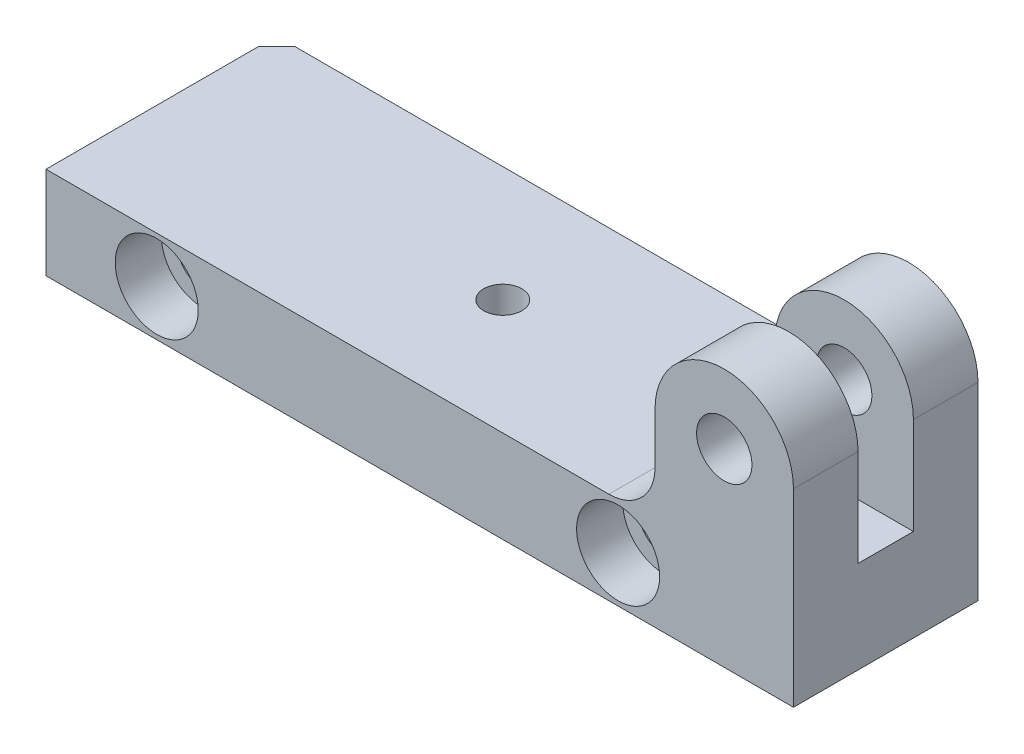
ISO-10303-21;
HEADER;
FILE_DESCRIPTION(('STEP AP214'),'2;1');
FILE_NAME('part.step','',(''),(''),'','','');
FILE_SCHEMA(('AUTOMOTIVE_DESIGN { 1 0 10303 214 1 1 1 1 }'));
ENDSEC;
DATA;
#1=APPLICATION_CONTEXT('core data for automotive mechanical design processes');
#2=APPLICATION_PROTOCOL_DEFINITION('international standard','automotive_design',2000,#1);
#3=PRODUCT_CONTEXT('',#1,'mechanical');
#4=PRODUCT('Part','Part','',(#3));
#5=PRODUCT_RELATED_PRODUCT_CATEGORY('part','',(#4));
#6=PRODUCT_DEFINITION_FORMATION('','',#4);
#7=PRODUCT_DEFINITION_CONTEXT('part definition',#1,'design');
#8=PRODUCT_DEFINITION('design','',#6,#7);
#9=PRODUCT_DEFINITION_SHAPE('','',#8);
#10=(LENGTH_UNIT() NAMED_UNIT(*) SI_UNIT(.MILLI.,.METRE.));
#11=(NAMED_UNIT(*) PLANE_ANGLE_UNIT() SI_UNIT($,.RADIAN.));
#12=(NAMED_UNIT(*) SI_UNIT($,.STERADIAN.) SOLID_ANGLE_UNIT());
#13=UNCERTAINTY_MEASURE_WITH_UNIT(LENGTH_MEASURE(1.E-05),#10,'distance_accuracy_value','');
#14=(GEOMETRIC_REPRESENTATION_CONTEXT(3) GLOBAL_UNCERTAINTY_ASSIGNED_CONTEXT((#13)) GLOBAL_UNIT_ASSIGNED_CONTEXT((#10,
#11,#12)) REPRESENTATION_CONTEXT('',''));
#15=CARTESIAN_POINT('',(0.,0.,0.));
#16=DIRECTION('',(0.,0.,1.));
#17=DIRECTION('',(1.,0.,0.));
#18=AXIS2_PLACEMENT_3D('',#15,#16,#17);
#19=CARTESIAN_POINT('',(-15.,15.,0.));
#20=DIRECTION('',(-1.,0.,0.));
#21=DIRECTION('',(0.,0.,1.));
#22=AXIS2_PLACEMENT_3D('',#19,#20,#21);
#23=PLANE('',#22);
#24=DIRECTION('',(0.,1.,0.));
#25=VECTOR('',#24,1.);
#26=CARTESIAN_POINT('',(-15.,10.,12.));
#27=LINE('',#26,#25);
#28=CARTESIAN_POINT('',(-15.,15.,12.));
#29=VERTEX_POINT('',#28);
#30=CARTESIAN_POINT('',(-15.,20.5,12.));
#31=VERTEX_POINT('',#30);
#32=EDGE_CURVE('E148',#29,#31,#27,.T.);
#33=ORIENTED_EDGE('',*,*,#32,.T.);
#34=DIRECTION('',(0.,0.,1.));
#35=VECTOR('',#34,1.);
#36=CARTESIAN_POINT('',(-15.,20.5,0.));
#37=LINE('',#36,#35);
#38=CARTESIAN_POINT('',(-15.,20.5,4.99999999999998));
#39=VERTEX_POINT('',#38);
#40=EDGE_CURVE('E123',#39,#31,#37,.T.);
#41=ORIENTED_EDGE('',*,*,#40,.F.);
#42=DIRECTION('',(0.,1.,0.));
#43=VECTOR('',#42,1.);
#44=CARTESIAN_POINT('',(-15.,10.,4.99999999999998));
#45=LINE('',#44,#43);
#46=CARTESIAN_POINT('',(-15.,15.,4.99999999999998));
#47=VERTEX_POINT('',#46);
#48=EDGE_CURVE('E118',#39,#47,#45,.F.);
#49=ORIENTED_EDGE('',*,*,#48,.T.);
#50=DIRECTION('',(0.,0.,1.));
#51=VECTOR('',#50,1.);
#52=CARTESIAN_POINT('',(-15.,15.,0.));
#53=LINE('',#52,#51);
#54=EDGE_CURVE('E120',#47,#29,#53,.T.);
#55=ORIENTED_EDGE('',*,*,#54,.T.);
#56=EDGE_LOOP('',(#33,#41,#49,#55));
#57=FACE_BOUND('',#56,.T.);
#58=ADVANCED_FACE('F17',(#57),#23,.T.);
#59=CARTESIAN_POINT('',(-7.5,20.5,0.));
#60=DIRECTION('',(0.,0.,1.));
#61=DIRECTION('',(1.,0.,0.));
#62=AXIS2_PLACEMENT_3D('',#59,#60,#61);
#63=CYLINDRICAL_SURFACE('',#62,3.);
#64=CARTESIAN_POINT('',(-7.5,20.5,12.));
#65=DIRECTION('',(0.,0.,1.));
#66=DIRECTION('',(1.,0.,0.));
#67=AXIS2_PLACEMENT_3D('',#64,#65,#66);
#68=CIRCLE('',#67,3.);
#69=CARTESIAN_POINT('',(-4.5,20.5,12.));
#70=VERTEX_POINT('',#69);
#71=EDGE_CURVE('E151',#70,#70,#68,.T.);
#72=ORIENTED_EDGE('',*,*,#71,.T.);
#73=EDGE_LOOP('',(#72));
#74=FACE_BOUND('',#73,.T.);
#75=CARTESIAN_POINT('',(-7.5,20.5,4.99999999999998));
#76=DIRECTION('',(0.,0.,1.));
#77=DIRECTION('',(1.,0.,0.));
#78=AXIS2_PLACEMENT_3D('',#75,#76,#77);
#79=CIRCLE('',#78,3.);
#80=CARTESIAN_POINT('',(-4.5,20.5,4.99999999999998));
#81=VERTEX_POINT('',#80);
#82=EDGE_CURVE('E140',#81,#81,#79,.F.);
#83=ORIENTED_EDGE('',*,*,#82,.T.);
#84=EDGE_LOOP('',(#83));
#85=FACE_BOUND('',#84,.T.);
#86=ADVANCED_FACE('F424',(#74,#85),#63,.F.);
#87=CARTESIAN_POINT('',(-69.,5.,20.));
#88=DIRECTION('',(0.,0.,1.));
#89=DIRECTION('',(1.,0.,0.));
#90=AXIS2_PLACEMENT_3D('',#87,#88,#89);
#91=PLANE('',#90);
#92=CARTESIAN_POINT('',(-69.,5.,20.));
#93=DIRECTION('',(0.,0.,1.));
#94=DIRECTION('',(1.,0.,0.));
#95=AXIS2_PLACEMENT_3D('',#92,#93,#94);
#96=CIRCLE('',#95,2.75);
#97=CARTESIAN_POINT('',(-66.25,5.,20.));
#98=VERTEX_POINT('',#97);
#99=EDGE_CURVE('E171',#98,#98,#96,.F.);
#100=ORIENTED_EDGE('',*,*,#99,.T.);
#101=EDGE_LOOP('',(#100));
#102=FACE_BOUND('',#101,.T.);
#103=CARTESIAN_POINT('',(-69.,5.,20.));
#104=DIRECTION('',(0.,0.,1.));
#105=DIRECTION('',(1.,0.,0.));
#106=AXIS2_PLACEMENT_3D('',#103,#104,#105);
#107=CIRCLE('',#106,4.5);
#108=CARTESIAN_POINT('',(-64.5,5.,20.));
#109=VERTEX_POINT('',#108);
#110=EDGE_CURVE('E161',#109,#109,#107,.T.);
#111=ORIENTED_EDGE('',*,*,#110,.T.);
#112=EDGE_LOOP('',(#111));
#113=FACE_BOUND('',#112,.T.);
#114=ADVANCED_FACE('F421',(#102,#113),#91,.T.);
#115=CARTESIAN_POINT('',(-19.,5.,20.));
#116=DIRECTION('',(0.,0.,1.));
#117=DIRECTION('',(1.,0.,0.));
#118=AXIS2_PLACEMENT_3D('',#115,#116,#117);
#119=PLANE('',#118);
#120=CARTESIAN_POINT('',(-19.,5.,20.));
#121=DIRECTION('',(0.,0.,1.));
#122=DIRECTION('',(1.,0.,0.));
#123=AXIS2_PLACEMENT_3D('',#120,#121,#122);
#124=CIRCLE('',#123,2.75);
#125=CARTESIAN_POINT('',(-16.25,5.,20.));
#126=VERTEX_POINT('',#125);
#127=EDGE_CURVE('E174',#126,#126,#124,.F.);
#128=ORIENTED_EDGE('',*,*,#127,.T.);
#129=EDGE_LOOP('',(#128));
#130=FACE_BOUND('',#129,.T.);
#131=CARTESIAN_POINT('',(-19.,5.,20.));
#132=DIRECTION('',(0.,0.,1.));
#133=DIRECTION('',(1.,0.,0.));
#134=AXIS2_PLACEMENT_3D('',#131,#132,#133);
#135=CIRCLE('',#134,4.5);
#136=CARTESIAN_POINT('',(-14.5,5.,20.));
#137=VERTEX_POINT('',#136);
#138=EDGE_CURVE('E165',#137,#137,#135,.T.);
#139=ORIENTED_EDGE('',*,*,#138,.T.);
#140=EDGE_LOOP('',(#139));
#141=FACE_BOUND('',#140,.T.);
#142=ADVANCED_FACE('F418',(#130,#141),#119,.T.);
#143=CARTESIAN_POINT('',(-20.,15.,0.));
#144=DIRECTION('',(0.,0.,1.));
#145=DIRECTION('',(1.,0.,0.));
#146=AXIS2_PLACEMENT_3D('',#143,#144,#145);
#147=CYLINDRICAL_SURFACE('',#146,5.);
#148=DIRECTION('',(0.,0.,1.));
#149=VECTOR('',#148,1.);
#150=CARTESIAN_POINT('',(-20.,10.,0.));
#151=LINE('',#150,#149);
#152=CARTESIAN_POINT('',(-20.,10.,12.));
#153=VERTEX_POINT('',#152);
#154=CARTESIAN_POINT('',(-20.,10.,4.99999999999999));
#155=VERTEX_POINT('',#154);
#156=EDGE_CURVE('E211',#153,#155,#151,.F.);
#157=ORIENTED_EDGE('',*,*,#156,.F.);
#158=CARTESIAN_POINT('',(-20.,15.,12.));
#159=DIRECTION('',(0.,0.,1.));
#160=DIRECTION('',(1.,0.,0.));
#161=AXIS2_PLACEMENT_3D('',#158,#159,#160);
#162=CIRCLE('',#161,5.);
#163=EDGE_CURVE('E133',#153,#29,#162,.T.);
#164=ORIENTED_EDGE('',*,*,#163,.T.);
#165=ORIENTED_EDGE('',*,*,#54,.F.);
#166=CARTESIAN_POINT('',(-20.,15.,4.99999999999999));
#167=DIRECTION('',(0.,0.,1.));
#168=DIRECTION('',(1.,0.,0.));
#169=AXIS2_PLACEMENT_3D('',#166,#167,#168);
#170=CIRCLE('',#169,5.);
#171=EDGE_CURVE('E20',#47,#155,#170,.F.);
#172=ORIENTED_EDGE('',*,*,#171,.T.);
#173=EDGE_LOOP('',(#157,#164,#165,#172));
#174=FACE_BOUND('',#173,.T.);
#175=ADVANCED_FACE('F131',(#174),#147,.F.);
#176=CARTESIAN_POINT('',(6.07456205532587,10.,4.99999999999998));
#177=DIRECTION('',(0.,0.,1.));
#178=DIRECTION('',(1.,0.,0.));
#179=AXIS2_PLACEMENT_3D('',#176,#177,#178);
#180=PLANE('',#179);
#181=ORIENTED_EDGE('',*,*,#82,.F.);
#182=EDGE_LOOP('',(#181));
#183=FACE_BOUND('',#182,.T.);
#184=DIRECTION('',(1.,0.,0.));
#185=VECTOR('',#184,1.);
#186=CARTESIAN_POINT('',(-81.,10.,4.99999999999999));
#187=LINE('',#186,#185);
#188=CARTESIAN_POINT('',(0.,10.,4.99999999999999));
#189=VERTEX_POINT('',#188);
#190=EDGE_CURVE('E138',#155,#189,#187,.T.);
#191=ORIENTED_EDGE('',*,*,#190,.F.);
#192=ORIENTED_EDGE('',*,*,#171,.F.);
#193=ORIENTED_EDGE('',*,*,#48,.F.);
#194=CARTESIAN_POINT('',(-7.5,20.5,4.99999999999998));
#195=DIRECTION('',(0.,0.,1.));
#196=DIRECTION('',(1.,0.,0.));
#197=AXIS2_PLACEMENT_3D('',#194,#195,#196);
#198=CIRCLE('',#197,7.5);
#199=CARTESIAN_POINT('',(0.,20.5,4.99999999999998));
#200=VERTEX_POINT('',#199);
#201=EDGE_CURVE('E142',#200,#39,#198,.T.);
#202=ORIENTED_EDGE('',*,*,#201,.F.);
#203=DIRECTION('',(0.,1.,0.));
#204=VECTOR('',#203,1.);
#205=CARTESIAN_POINT('',(0.,20.5,4.99999999999998));
#206=LINE('',#205,#204);
#207=EDGE_CURVE('E240',#189,#200,#206,.T.);
#208=ORIENTED_EDGE('',*,*,#207,.F.);
#209=EDGE_LOOP('',(#191,#192,#193,#202,#208));
#210=FACE_BOUND('',#209,.T.);
#211=ADVANCED_FACE('F136',(#183,#210),#180,.F.);
#212=CARTESIAN_POINT('',(-7.5,20.5,0.));
#213=DIRECTION('',(0.,0.,1.));
#214=DIRECTION('',(1.,0.,0.));
#215=AXIS2_PLACEMENT_3D('',#212,#213,#214);
#216=CYLINDRICAL_SURFACE('',#215,7.5);
#217=CARTESIAN_POINT('',(-7.5,20.5,12.));
#218=DIRECTION('',(0.,0.,1.));
#219=DIRECTION('',(1.,0.,0.));
#220=AXIS2_PLACEMENT_3D('',#217,#218,#219);
#221=CIRCLE('',#220,7.5);
#222=CARTESIAN_POINT('',(0.,20.5,12.));
#223=VERTEX_POINT('',#222);
#224=EDGE_CURVE('E149',#31,#223,#221,.F.);
#225=ORIENTED_EDGE('',*,*,#224,.T.);
#226=DIRECTION('',(0.,0.,-1.));
#227=VECTOR('',#226,1.);
#228=CARTESIAN_POINT('',(0.,20.5,0.));
#229=LINE('',#228,#227);
#230=EDGE_CURVE('E246',#200,#223,#229,.F.);
#231=ORIENTED_EDGE('',*,*,#230,.F.);
#232=ORIENTED_EDGE('',*,*,#201,.T.);
#233=ORIENTED_EDGE('',*,*,#40,.T.);
#234=EDGE_LOOP('',(#225,#231,#232,#233));
#235=FACE_BOUND('',#234,.T.);
#236=ADVANCED_FACE('F373',(#235),#216,.T.);
#237=CARTESIAN_POINT('',(-52.9946393017664,10.,12.));
#238=DIRECTION('',(0.,0.,-1.));
#239=DIRECTION('',(-1.,0.,0.));
#240=AXIS2_PLACEMENT_3D('',#237,#238,#239);
#241=PLANE('',#240);
#242=ORIENTED_EDGE('',*,*,#71,.F.);
#243=EDGE_LOOP('',(#242));
#244=FACE_BOUND('',#243,.T.);
#245=ORIENTED_EDGE('',*,*,#224,.F.);
#246=ORIENTED_EDGE('',*,*,#32,.F.);
#247=ORIENTED_EDGE('',*,*,#163,.F.);
#248=DIRECTION('',(1.,0.,0.));
#249=VECTOR('',#248,1.);
#250=CARTESIAN_POINT('',(-81.,10.,12.));
#251=LINE('',#250,#249);
#252=CARTESIAN_POINT('',(0.,10.,12.));
#253=VERTEX_POINT('',#252);
#254=EDGE_CURVE('E213',#253,#153,#251,.F.);
#255=ORIENTED_EDGE('',*,*,#254,.F.);
#256=DIRECTION('',(0.,1.,0.));
#257=VECTOR('',#256,1.);
#258=CARTESIAN_POINT('',(0.,20.5,12.));
#259=LINE('',#258,#257);
#260=EDGE_CURVE('E249',#223,#253,#259,.F.);
#261=ORIENTED_EDGE('',*,*,#260,.F.);
#262=EDGE_LOOP('',(#245,#246,#247,#255,#261));
#263=FACE_BOUND('',#262,.T.);
#264=ADVANCED_FACE('F371',(#244,#263),#241,.F.);
#265=CARTESIAN_POINT('',(5.02476111880649,10.,18.));
#266=DIRECTION('',(0.,0.,1.));
#267=DIRECTION('',(1.,0.,0.));
#268=AXIS2_PLACEMENT_3D('',#265,#266,#267);
#269=PLANE('',#268);
#270=CARTESIAN_POINT('',(-7.5,20.5,18.));
#271=DIRECTION('',(0.,0.,1.));
#272=DIRECTION('',(1.,0.,0.));
#273=AXIS2_PLACEMENT_3D('',#270,#271,#272);
#274=CIRCLE('',#273,3.);
#275=CARTESIAN_POINT('',(-4.5,20.5,18.));
#276=VERTEX_POINT('',#275);
#277=EDGE_CURVE('E168',#276,#276,#274,.T.);
#278=ORIENTED_EDGE('',*,*,#277,.T.);
#279=EDGE_LOOP('',(#278));
#280=FACE_BOUND('',#279,.T.);
#281=DIRECTION('',(1.,0.,0.));
#282=VECTOR('',#281,1.);
#283=CARTESIAN_POINT('',(-81.,10.,18.));
#284=LINE('',#283,#282);
#285=CARTESIAN_POINT('',(-20.,10.,18.));
#286=VERTEX_POINT('',#285);
#287=CARTESIAN_POINT('',(0.,10.,18.));
#288=VERTEX_POINT('',#287);
#289=EDGE_CURVE('E260',#286,#288,#284,.T.);
#290=ORIENTED_EDGE('',*,*,#289,.F.);
#291=CARTESIAN_POINT('',(-20.,15.,18.));
#292=DIRECTION('',(0.,0.,1.));
#293=DIRECTION('',(1.,0.,0.));
#294=AXIS2_PLACEMENT_3D('',#291,#292,#293);
#295=CIRCLE('',#294,5.);
#296=CARTESIAN_POINT('',(-15.,15.,18.));
#297=VERTEX_POINT('',#296);
#298=EDGE_CURVE('E158',#286,#297,#295,.T.);
#299=ORIENTED_EDGE('',*,*,#298,.T.);
#300=DIRECTION('',(0.,1.,0.));
#301=VECTOR('',#300,1.);
#302=CARTESIAN_POINT('',(-15.,15.,18.));
#303=LINE('',#302,#301);
#304=CARTESIAN_POINT('',(-15.,20.5,18.));
#305=VERTEX_POINT('',#304);
#306=EDGE_CURVE('E157',#305,#297,#303,.F.);
#307=ORIENTED_EDGE('',*,*,#306,.F.);
#308=CARTESIAN_POINT('',(-7.5,20.5,18.));
#309=DIRECTION('',(0.,0.,1.));
#310=DIRECTION('',(1.,0.,0.));
#311=AXIS2_PLACEMENT_3D('',#308,#309,#310);
#312=CIRCLE('',#311,7.5);
#313=CARTESIAN_POINT('',(0.,20.5,18.));
#314=VERTEX_POINT('',#313);
#315=EDGE_CURVE('E154',#314,#305,#312,.T.);
#316=ORIENTED_EDGE('',*,*,#315,.F.);
#317=DIRECTION('',(0.,1.,0.));
#318=VECTOR('',#317,1.);
#319=CARTESIAN_POINT('',(0.,20.5,18.));
#320=LINE('',#319,#318);
#321=EDGE_CURVE('E268',#288,#314,#320,.T.);
#322=ORIENTED_EDGE('',*,*,#321,.F.);
#323=EDGE_LOOP('',(#290,#299,#307,#316,#322));
#324=FACE_BOUND('',#323,.T.);
#325=ADVANCED_FACE('F380',(#280,#324),#269,.F.);
#326=CARTESIAN_POINT('',(-7.5,20.5,0.));
#327=DIRECTION('',(0.,0.,1.));
#328=DIRECTION('',(1.,0.,0.));
#329=AXIS2_PLACEMENT_3D('',#326,#327,#328);
#330=CYLINDRICAL_SURFACE('',#329,7.5);
#331=CARTESIAN_POINT('',(-7.5,20.5,25.));
#332=DIRECTION('',(0.,0.,1.));
#333=DIRECTION('',(1.,0.,0.));
#334=AXIS2_PLACEMENT_3D('',#331,#332,#333);
#335=CIRCLE('',#334,7.5);
#336=CARTESIAN_POINT('',(0.,20.5,25.));
#337=VERTEX_POINT('',#336);
#338=CARTESIAN_POINT('',(-15.,20.5,25.));
#339=VERTEX_POINT('',#338);
#340=EDGE_CURVE('E178',#337,#339,#335,.T.);
#341=ORIENTED_EDGE('',*,*,#340,.F.);
#342=DIRECTION('',(0.,0.,-1.));
#343=VECTOR('',#342,1.);
#344=CARTESIAN_POINT('',(0.,20.5,0.));
#345=LINE('',#344,#343);
#346=EDGE_CURVE('E273',#314,#337,#345,.F.);
#347=ORIENTED_EDGE('',*,*,#346,.F.);
#348=ORIENTED_EDGE('',*,*,#315,.T.);
#349=DIRECTION('',(0.,0.,1.));
#350=VECTOR('',#349,1.);
#351=CARTESIAN_POINT('',(-15.,20.5,0.));
#352=LINE('',#351,#350);
#353=EDGE_CURVE('E210',#339,#305,#352,.F.);
#354=ORIENTED_EDGE('',*,*,#353,.F.);
#355=EDGE_LOOP('',(#341,#347,#348,#354));
#356=FACE_BOUND('',#355,.T.);
#357=ADVANCED_FACE('F382',(#356),#330,.T.);
#358=CARTESIAN_POINT('',(-15.,15.,0.));
#359=DIRECTION('',(-1.,0.,0.));
#360=DIRECTION('',(0.,0.,1.));
#361=AXIS2_PLACEMENT_3D('',#358,#359,#360);
#362=PLANE('',#361);
#363=DIRECTION('',(0.,1.,0.));
#364=VECTOR('',#363,1.);
#365=CARTESIAN_POINT('',(-15.,7.89915521810206,25.));
#366=LINE('',#365,#364);
#367=CARTESIAN_POINT('',(-15.,15.,25.));
#368=VERTEX_POINT('',#367);
#369=EDGE_CURVE('E181',#339,#368,#366,.F.);
#370=ORIENTED_EDGE('',*,*,#369,.F.);
#371=ORIENTED_EDGE('',*,*,#353,.T.);
#372=ORIENTED_EDGE('',*,*,#306,.T.);
#373=DIRECTION('',(0.,0.,1.));
#374=VECTOR('',#373,1.);
#375=CARTESIAN_POINT('',(-15.,15.,0.));
#376=LINE('',#375,#374);
#377=EDGE_CURVE('E162',#297,#368,#376,.T.);
#378=ORIENTED_EDGE('',*,*,#377,.T.);
#379=EDGE_LOOP('',(#370,#371,#372,#378));
#380=FACE_BOUND('',#379,.T.);
#381=ADVANCED_FACE('F386',(#380),#362,.T.);
#382=CARTESIAN_POINT('',(-20.,15.,0.));
#383=DIRECTION('',(0.,0.,1.));
#384=DIRECTION('',(1.,0.,0.));
#385=AXIS2_PLACEMENT_3D('',#382,#383,#384);
#386=CYLINDRICAL_SURFACE('',#385,5.);
#387=DIRECTION('',(0.,0.,1.));
#388=VECTOR('',#387,1.);
#389=CARTESIAN_POINT('',(-20.,10.,0.));
#390=LINE('',#389,#388);
#391=CARTESIAN_POINT('',(-20.,10.,25.));
#392=VERTEX_POINT('',#391);
#393=EDGE_CURVE('E177',#392,#286,#390,.F.);
#394=ORIENTED_EDGE('',*,*,#393,.F.);
#395=CARTESIAN_POINT('',(-20.,15.,25.));
#396=DIRECTION('',(0.,0.,1.));
#397=DIRECTION('',(1.,0.,0.));
#398=AXIS2_PLACEMENT_3D('',#395,#396,#397);
#399=CIRCLE('',#398,5.);
#400=EDGE_CURVE('E183',#368,#392,#399,.F.);
#401=ORIENTED_EDGE('',*,*,#400,.F.);
#402=ORIENTED_EDGE('',*,*,#377,.F.);
#403=ORIENTED_EDGE('',*,*,#298,.F.);
#404=EDGE_LOOP('',(#394,#401,#402,#403));
#405=FACE_BOUND('',#404,.T.);
#406=ADVANCED_FACE('F389',(#405),#386,.F.);
#407=CARTESIAN_POINT('',(-69.,5.,22.5));
#408=DIRECTION('',(0.,0.,1.));
#409=DIRECTION('',(1.,0.,0.));
#410=AXIS2_PLACEMENT_3D('',#407,#408,#409);
#411=CYLINDRICAL_SURFACE('',#410,4.5);
#412=ORIENTED_EDGE('',*,*,#110,.F.);
#413=EDGE_LOOP('',(#412));
#414=FACE_BOUND('',#413,.T.);
#415=CARTESIAN_POINT('',(-69.,5.,25.));
#416=DIRECTION('',(0.,0.,1.));
#417=DIRECTION('',(1.,0.,0.));
#418=AXIS2_PLACEMENT_3D('',#415,#416,#417);
#419=CIRCLE('',#418,4.5);
#420=CARTESIAN_POINT('',(-64.5,5.,25.));
#421=VERTEX_POINT('',#420);
#422=EDGE_CURVE('E187',#421,#421,#419,.F.);
#423=ORIENTED_EDGE('',*,*,#422,.F.);
#424=EDGE_LOOP('',(#423));
#425=FACE_BOUND('',#424,.T.);
#426=ADVANCED_FACE('F391',(#414,#425),#411,.F.);
#427=CARTESIAN_POINT('',(-19.,5.,22.5));
#428=DIRECTION('',(0.,0.,1.));
#429=DIRECTION('',(1.,0.,0.));
#430=AXIS2_PLACEMENT_3D('',#427,#428,#429);
#431=CYLINDRICAL_SURFACE('',#430,4.5);
#432=ORIENTED_EDGE('',*,*,#138,.F.);
#433=EDGE_LOOP('',(#432));
#434=FACE_BOUND('',#433,.T.);
#435=CARTESIAN_POINT('',(-19.,5.,25.));
#436=DIRECTION('',(0.,0.,1.));
#437=DIRECTION('',(1.,0.,0.));
#438=AXIS2_PLACEMENT_3D('',#435,#436,#437);
#439=CIRCLE('',#438,4.5);
#440=CARTESIAN_POINT('',(-14.5,5.,25.));
#441=VERTEX_POINT('',#440);
#442=EDGE_CURVE('E190',#441,#441,#439,.F.);
#443=ORIENTED_EDGE('',*,*,#442,.F.);
#444=EDGE_LOOP('',(#443));
#445=FACE_BOUND('',#444,.T.);
#446=ADVANCED_FACE('F397',(#434,#445),#431,.F.);
#447=CARTESIAN_POINT('',(-7.5,20.5,0.));
#448=DIRECTION('',(0.,0.,1.));
#449=DIRECTION('',(1.,0.,0.));
#450=AXIS2_PLACEMENT_3D('',#447,#448,#449);
#451=CYLINDRICAL_SURFACE('',#450,3.);
#452=ORIENTED_EDGE('',*,*,#277,.F.);
#453=EDGE_LOOP('',(#452));
#454=FACE_BOUND('',#453,.T.);
#455=CARTESIAN_POINT('',(-7.5,20.5,25.));
#456=DIRECTION('',(0.,0.,1.));
#457=DIRECTION('',(1.,0.,0.));
#458=AXIS2_PLACEMENT_3D('',#455,#456,#457);
#459=CIRCLE('',#458,3.);
#460=CARTESIAN_POINT('',(-4.5,20.5,25.));
#461=VERTEX_POINT('',#460);
#462=EDGE_CURVE('E193',#461,#461,#459,.F.);
#463=ORIENTED_EDGE('',*,*,#462,.F.);
#464=EDGE_LOOP('',(#463));
#465=FACE_BOUND('',#464,.T.);
#466=ADVANCED_FACE('F516',(#454,#465),#451,.F.);
#467=CARTESIAN_POINT('',(-69.,5.,-64.2748564826626));
#468=DIRECTION('',(0.,0.,1.));
#469=DIRECTION('',(1.,0.,0.));
#470=AXIS2_PLACEMENT_3D('',#467,#468,#469);
#471=CYLINDRICAL_SURFACE('',#470,2.75);
#472=ORIENTED_EDGE('',*,*,#99,.F.);
#473=EDGE_LOOP('',(#472));
#474=FACE_BOUND('',#473,.T.);
#475=CARTESIAN_POINT('',(-69.,5.,0.));
#476=DIRECTION('',(0.,0.,1.));
#477=DIRECTION('',(1.,0.,0.));
#478=AXIS2_PLACEMENT_3D('',#475,#476,#477);
#479=CIRCLE('',#478,2.75);
#480=CARTESIAN_POINT('',(-66.25,5.,0.));
#481=VERTEX_POINT('',#480);
#482=EDGE_CURVE('E197',#481,#481,#479,.F.);
#483=ORIENTED_EDGE('',*,*,#482,.T.);
#484=EDGE_LOOP('',(#483));
#485=FACE_BOUND('',#484,.T.);
#486=ADVANCED_FACE('F525',(#474,#485),#471,.F.);
#487=CARTESIAN_POINT('',(-19.,5.,-64.2748564826626));
#488=DIRECTION('',(0.,0.,1.));
#489=DIRECTION('',(1.,0.,0.));
#490=AXIS2_PLACEMENT_3D('',#487,#488,#489);
#491=CYLINDRICAL_SURFACE('',#490,2.75);
#492=ORIENTED_EDGE('',*,*,#127,.F.);
#493=EDGE_LOOP('',(#492));
#494=FACE_BOUND('',#493,.T.);
#495=CARTESIAN_POINT('',(-19.,5.,0.));
#496=DIRECTION('',(0.,0.,1.));
#497=DIRECTION('',(1.,0.,0.));
#498=AXIS2_PLACEMENT_3D('',#495,#496,#497);
#499=CIRCLE('',#498,2.75);
#500=CARTESIAN_POINT('',(-16.25,5.,0.));
#501=VERTEX_POINT('',#500);
#502=EDGE_CURVE('E200',#501,#501,#499,.F.);
#503=ORIENTED_EDGE('',*,*,#502,.T.);
#504=EDGE_LOOP('',(#503));
#505=FACE_BOUND('',#504,.T.);
#506=ADVANCED_FACE('F365',(#494,#505),#491,.F.);
#507=CARTESIAN_POINT('',(-81.,10.,0.));
#508=DIRECTION('',(0.,1.,0.));
#509=DIRECTION('',(0.,0.,1.));
#510=AXIS2_PLACEMENT_3D('',#507,#508,#509);
#511=PLANE('',#510);
#512=CARTESIAN_POINT('',(-44.,9.99999999999999,12.5));
#513=DIRECTION('',(0.,-1.,0.));
#514=DIRECTION('',(1.,0.,0.));
#515=AXIS2_PLACEMENT_3D('',#512,#513,#514);
#516=CIRCLE('',#515,2.067);
#517=CARTESIAN_POINT('',(-41.933,9.99999999999999,12.5));
#518=VERTEX_POINT('',#517);
#519=EDGE_CURVE('E204',#518,#518,#516,.T.);
#520=ORIENTED_EDGE('',*,*,#519,.T.);
#521=EDGE_LOOP('',(#520));
#522=FACE_BOUND('',#521,.T.);
#523=ORIENTED_EDGE('',*,*,#156,.T.);
#524=ORIENTED_EDGE('',*,*,#190,.T.);
#525=DIRECTION('',(-0.866025403784439,0.,-0.5));
#526=VECTOR('',#525,1.);
#527=CARTESIAN_POINT('',(-4.3301270189222,10.,2.5));
#528=LINE('',#527,#526);
#529=CARTESIAN_POINT('',(-8.66025403784439,10.,0.));
#530=VERTEX_POINT('',#529);
#531=EDGE_CURVE('E226',#530,#189,#528,.F.);
#532=ORIENTED_EDGE('',*,*,#531,.F.);
#533=DIRECTION('',(1.,0.,0.));
#534=VECTOR('',#533,1.);
#535=CARTESIAN_POINT('',(-36.1139137137425,10.,0.));
#536=LINE('',#535,#534);
#537=CARTESIAN_POINT('',(-79.,10.,0.));
#538=VERTEX_POINT('',#537);
#539=EDGE_CURVE('E216',#530,#538,#536,.F.);
#540=ORIENTED_EDGE('',*,*,#539,.T.);
#541=DIRECTION('',(-0.707106781186546,0.,0.707106781186549));
#542=VECTOR('',#541,1.);
#543=CARTESIAN_POINT('',(-80.,10.,1.));
#544=LINE('',#543,#542);
#545=CARTESIAN_POINT('',(-81.,10.,2.));
#546=VERTEX_POINT('',#545);
#547=EDGE_CURVE('E218',#546,#538,#544,.F.);
#548=ORIENTED_EDGE('',*,*,#547,.F.);
#549=DIRECTION('',(0.,0.,1.));
#550=VECTOR('',#549,1.);
#551=CARTESIAN_POINT('',(-81.,10.,0.));
#552=LINE('',#551,#550);
#553=CARTESIAN_POINT('',(-81.,10.,25.));
#554=VERTEX_POINT('',#553);
#555=EDGE_CURVE('E292',#554,#546,#552,.F.);
#556=ORIENTED_EDGE('',*,*,#555,.F.);
#557=DIRECTION('',(1.,0.,0.));
#558=VECTOR('',#557,1.);
#559=CARTESIAN_POINT('',(-36.1139137137425,10.,25.));
#560=LINE('',#559,#558);
#561=EDGE_CURVE('E186',#392,#554,#560,.F.);
#562=ORIENTED_EDGE('',*,*,#561,.F.);
#563=ORIENTED_EDGE('',*,*,#393,.T.);
#564=ORIENTED_EDGE('',*,*,#289,.T.);
#565=DIRECTION('',(0.,0.,-1.));
#566=VECTOR('',#565,1.);
#567=CARTESIAN_POINT('',(0.,10.,0.));
#568=LINE('',#567,#566);
#569=EDGE_CURVE('E255',#253,#288,#568,.F.);
#570=ORIENTED_EDGE('',*,*,#569,.F.);
#571=ORIENTED_EDGE('',*,*,#254,.T.);
#572=EDGE_LOOP('',(#523,#524,#532,#540,#548,#556,#562,#563,#564,#570,#571));
#573=FACE_BOUND('',#572,.T.);
#574=ADVANCED_FACE('F362',(#522,#573),#511,.T.);
#575=CARTESIAN_POINT('',(-4.3301270189222,14.199577609051,2.5));
#576=DIRECTION('',(0.5,0.,-0.866025403784439));
#577=DIRECTION('',(-0.866025403784439,0.,-0.5));
#578=AXIS2_PLACEMENT_3D('',#575,#576,#577);
#579=PLANE('',#578);
#580=ORIENTED_EDGE('',*,*,#531,.T.);
#581=DIRECTION('',(0.,1.,0.));
#582=VECTOR('',#581,1.);
#583=CARTESIAN_POINT('',(0.,20.5,5.));
#584=LINE('',#583,#582);
#585=CARTESIAN_POINT('',(0.,0.,5.));
#586=VERTEX_POINT('',#585);
#587=EDGE_CURVE('E236',#586,#189,#584,.T.);
#588=ORIENTED_EDGE('',*,*,#587,.F.);
#589=DIRECTION('',(0.866025403784439,0.,0.5));
#590=VECTOR('',#589,1.);
#591=CARTESIAN_POINT('',(-8.66025403784439,0.,0.));
#592=LINE('',#591,#590);
#593=CARTESIAN_POINT('',(-8.66025403784439,0.,0.));
#594=VERTEX_POINT('',#593);
#595=EDGE_CURVE('E206',#594,#586,#592,.T.);
#596=ORIENTED_EDGE('',*,*,#595,.F.);
#597=DIRECTION('',(0.,1.,0.));
#598=VECTOR('',#597,1.);
#599=CARTESIAN_POINT('',(-8.66025403784439,7.89915521810206,0.));
#600=LINE('',#599,#598);
#601=EDGE_CURVE('E201',#594,#530,#600,.T.);
#602=ORIENTED_EDGE('',*,*,#601,.T.);
#603=EDGE_LOOP('',(#580,#588,#596,#602));
#604=FACE_BOUND('',#603,.T.);
#605=ADVANCED_FACE('F325',(#604),#579,.T.);
#606=CARTESIAN_POINT('',(0.,20.5,0.));
#607=DIRECTION('',(1.,0.,0.));
#608=DIRECTION('',(0.,0.,-1.));
#609=AXIS2_PLACEMENT_3D('',#606,#607,#608);
#610=PLANE('',#609);
#611=DIRECTION('',(0.,1.,0.));
#612=VECTOR('',#611,1.);
#613=CARTESIAN_POINT('',(0.,7.89915521810206,25.));
#614=LINE('',#613,#612);
#615=CARTESIAN_POINT('',(0.,0.,25.));
#616=VERTEX_POINT('',#615);
#617=EDGE_CURVE('E182',#616,#337,#614,.T.);
#618=ORIENTED_EDGE('',*,*,#617,.F.);
#619=DIRECTION('',(0.,0.,-1.));
#620=VECTOR('',#619,1.);
#621=CARTESIAN_POINT('',(0.,0.,0.));
#622=LINE('',#621,#620);
#623=EDGE_CURVE('E231',#586,#616,#622,.F.);
#624=ORIENTED_EDGE('',*,*,#623,.F.);
#625=ORIENTED_EDGE('',*,*,#587,.T.);
#626=ORIENTED_EDGE('',*,*,#207,.T.);
#627=ORIENTED_EDGE('',*,*,#230,.T.);
#628=ORIENTED_EDGE('',*,*,#260,.T.);
#629=ORIENTED_EDGE('',*,*,#569,.T.);
#630=ORIENTED_EDGE('',*,*,#321,.T.);
#631=ORIENTED_EDGE('',*,*,#346,.T.);
#632=EDGE_LOOP('',(#618,#624,#625,#626,#627,#628,#629,#630,#631));
#633=FACE_BOUND('',#632,.T.);
#634=ADVANCED_FACE('F328',(#633),#610,.T.);
#635=CARTESIAN_POINT('',(-36.1139137137425,7.89915521810206,25.));
#636=DIRECTION('',(0.,0.,1.));
#637=DIRECTION('',(1.,0.,0.));
#638=AXIS2_PLACEMENT_3D('',#635,#636,#637);
#639=PLANE('',#638);
#640=ORIENTED_EDGE('',*,*,#462,.T.);
#641=EDGE_LOOP('',(#640));
#642=FACE_BOUND('',#641,.T.);
#643=ORIENTED_EDGE('',*,*,#442,.T.);
#644=EDGE_LOOP('',(#643));
#645=FACE_BOUND('',#644,.T.);
#646=ORIENTED_EDGE('',*,*,#422,.T.);
#647=EDGE_LOOP('',(#646));
#648=FACE_BOUND('',#647,.T.);
#649=ORIENTED_EDGE('',*,*,#561,.T.);
#650=DIRECTION('',(0.,1.,0.));
#651=VECTOR('',#650,1.);
#652=CARTESIAN_POINT('',(-81.,0.,25.));
#653=LINE('',#652,#651);
#654=CARTESIAN_POINT('',(-81.,0.,25.));
#655=VERTEX_POINT('',#654);
#656=EDGE_CURVE('E196',#655,#554,#653,.T.);
#657=ORIENTED_EDGE('',*,*,#656,.F.);
#658=DIRECTION('',(1.,0.,0.));
#659=VECTOR('',#658,1.);
#660=CARTESIAN_POINT('',(0.,0.,25.));
#661=LINE('',#660,#659);
#662=EDGE_CURVE('E278',#616,#655,#661,.F.);
#663=ORIENTED_EDGE('',*,*,#662,.F.);
#664=ORIENTED_EDGE('',*,*,#617,.T.);
#665=ORIENTED_EDGE('',*,*,#340,.T.);
#666=ORIENTED_EDGE('',*,*,#369,.T.);
#667=ORIENTED_EDGE('',*,*,#400,.T.);
#668=EDGE_LOOP('',(#649,#657,#663,#664,#665,#666,#667));
#669=FACE_BOUND('',#668,.T.);
#670=ADVANCED_FACE('F332',(#642,#645,#648,#669),#639,.T.);
#671=CARTESIAN_POINT('',(-81.,0.,0.));
#672=DIRECTION('',(-1.,0.,0.));
#673=DIRECTION('',(0.,0.,1.));
#674=AXIS2_PLACEMENT_3D('',#671,#672,#673);
#675=PLANE('',#674);
#676=ORIENTED_EDGE('',*,*,#656,.T.);
#677=ORIENTED_EDGE('',*,*,#555,.T.);
#678=DIRECTION('',(0.,1.,0.));
#679=VECTOR('',#678,1.);
#680=CARTESIAN_POINT('',(-81.,3.94957760905103,2.));
#681=LINE('',#680,#679);
#682=CARTESIAN_POINT('',(-81.,0.,2.));
#683=VERTEX_POINT('',#682);
#684=EDGE_CURVE('E296',#683,#546,#681,.T.);
#685=ORIENTED_EDGE('',*,*,#684,.F.);
#686=DIRECTION('',(0.,0.,-1.));
#687=VECTOR('',#686,1.);
#688=CARTESIAN_POINT('',(-81.,0.,0.));
#689=LINE('',#688,#687);
#690=EDGE_CURVE('E283',#655,#683,#689,.T.);
#691=ORIENTED_EDGE('',*,*,#690,.F.);
#692=EDGE_LOOP('',(#676,#677,#685,#691));
#693=FACE_BOUND('',#692,.T.);
#694=ADVANCED_FACE('F336',(#693),#675,.T.);
#695=CARTESIAN_POINT('',(-80.,3.94957760905103,1.));
#696=DIRECTION('',(-0.707106781186549,0.,-0.707106781186546));
#697=DIRECTION('',(-0.707106781186546,0.,0.707106781186549));
#698=AXIS2_PLACEMENT_3D('',#695,#696,#697);
#699=PLANE('',#698);
#700=ORIENTED_EDGE('',*,*,#547,.T.);
#701=DIRECTION('',(0.,1.,0.));
#702=VECTOR('',#701,1.);
#703=CARTESIAN_POINT('',(-79.,7.89915521810206,0.));
#704=LINE('',#703,#702);
#705=CARTESIAN_POINT('',(-79.,0.,0.));
#706=VERTEX_POINT('',#705);
#707=EDGE_CURVE('E35',#538,#706,#704,.F.);
#708=ORIENTED_EDGE('',*,*,#707,.T.);
#709=DIRECTION('',(0.707106781186548,0.,-0.707106781186547));
#710=VECTOR('',#709,1.);
#711=CARTESIAN_POINT('',(-81.,0.,2.));
#712=LINE('',#711,#710);
#713=EDGE_CURVE('E314',#683,#706,#712,.T.);
#714=ORIENTED_EDGE('',*,*,#713,.F.);
#715=ORIENTED_EDGE('',*,*,#684,.T.);
#716=EDGE_LOOP('',(#700,#708,#714,#715));
#717=FACE_BOUND('',#716,.T.);
#718=ADVANCED_FACE('F338',(#717),#699,.T.);
#719=CARTESIAN_POINT('',(-36.1139137137425,7.89915521810206,0.));
#720=DIRECTION('',(0.,0.,1.));
#721=DIRECTION('',(1.,0.,0.));
#722=AXIS2_PLACEMENT_3D('',#719,#720,#721);
#723=PLANE('',#722);
#724=ORIENTED_EDGE('',*,*,#502,.F.);
#725=EDGE_LOOP('',(#724));
#726=FACE_BOUND('',#725,.T.);
#727=ORIENTED_EDGE('',*,*,#482,.F.);
#728=EDGE_LOOP('',(#727));
#729=FACE_BOUND('',#728,.T.);
#730=DIRECTION('',(1.,0.,0.));
#731=VECTOR('',#730,1.);
#732=CARTESIAN_POINT('',(0.,0.,0.));
#733=LINE('',#732,#731);
#734=EDGE_CURVE('E26',#706,#594,#733,.T.);
#735=ORIENTED_EDGE('',*,*,#734,.F.);
#736=ORIENTED_EDGE('',*,*,#707,.F.);
#737=ORIENTED_EDGE('',*,*,#539,.F.);
#738=ORIENTED_EDGE('',*,*,#601,.F.);
#739=EDGE_LOOP('',(#735,#736,#737,#738));
#740=FACE_BOUND('',#739,.T.);
#741=ADVANCED_FACE('F322',(#726,#729,#740),#723,.F.);
#742=CARTESIAN_POINT('',(-44.,89.2748564826626,12.5));
#743=DIRECTION('',(0.,-1.,0.));
#744=DIRECTION('',(1.,0.,0.));
#745=AXIS2_PLACEMENT_3D('',#742,#743,#744);
#746=CYLINDRICAL_SURFACE('',#745,2.067);
#747=CARTESIAN_POINT('',(-44.,0.,12.5));
#748=DIRECTION('',(0.,-1.,0.));
#749=DIRECTION('',(1.,0.,0.));
#750=AXIS2_PLACEMENT_3D('',#747,#748,#749);
#751=CIRCLE('',#750,2.067);
#752=CARTESIAN_POINT('',(-41.933,0.,12.5));
#753=VERTEX_POINT('',#752);
#754=EDGE_CURVE('E11',#753,#753,#751,.F.);
#755=ORIENTED_EDGE('',*,*,#754,.F.);
#756=EDGE_LOOP('',(#755));
#757=FACE_BOUND('',#756,.T.);
#758=ORIENTED_EDGE('',*,*,#519,.F.);
#759=EDGE_LOOP('',(#758));
#760=FACE_BOUND('',#759,.T.);
#761=ADVANCED_FACE('F346',(#757,#760),#746,.F.);
#762=CARTESIAN_POINT('',(0.,0.,0.));
#763=DIRECTION('',(0.,-1.,0.));
#764=DIRECTION('',(0.,0.,-1.));
#765=AXIS2_PLACEMENT_3D('',#762,#763,#764);
#766=PLANE('',#765);
#767=ORIENTED_EDGE('',*,*,#754,.T.);
#768=EDGE_LOOP('',(#767));
#769=FACE_BOUND('',#768,.T.);
#770=ORIENTED_EDGE('',*,*,#713,.T.);
#771=ORIENTED_EDGE('',*,*,#734,.T.);
#772=ORIENTED_EDGE('',*,*,#595,.T.);
#773=ORIENTED_EDGE('',*,*,#623,.T.);
#774=ORIENTED_EDGE('',*,*,#662,.T.);
#775=ORIENTED_EDGE('',*,*,#690,.T.);
#776=EDGE_LOOP('',(#770,#771,#772,#773,#774,#775));
#777=FACE_BOUND('',#776,.T.);
#778=ADVANCED_FACE('F319',(#769,#777),#766,.T.);
#779=CLOSED_SHELL('',(#58,#86,#114,#142,#175,#211,#236,#264,#325,#357,#381,#406,#426,#446,#466,
#486,#506,#574,#605,#634,#670,#694,#718,#741,#761,#778));
#780=MANIFOLD_SOLID_BREP('B1',#779);
#781=ADVANCED_BREP_SHAPE_REPRESENTATION('',(#18,#780),#14);
#782=SHAPE_DEFINITION_REPRESENTATION(#9,#781);
ENDSEC;
END-ISO-10303-21;
